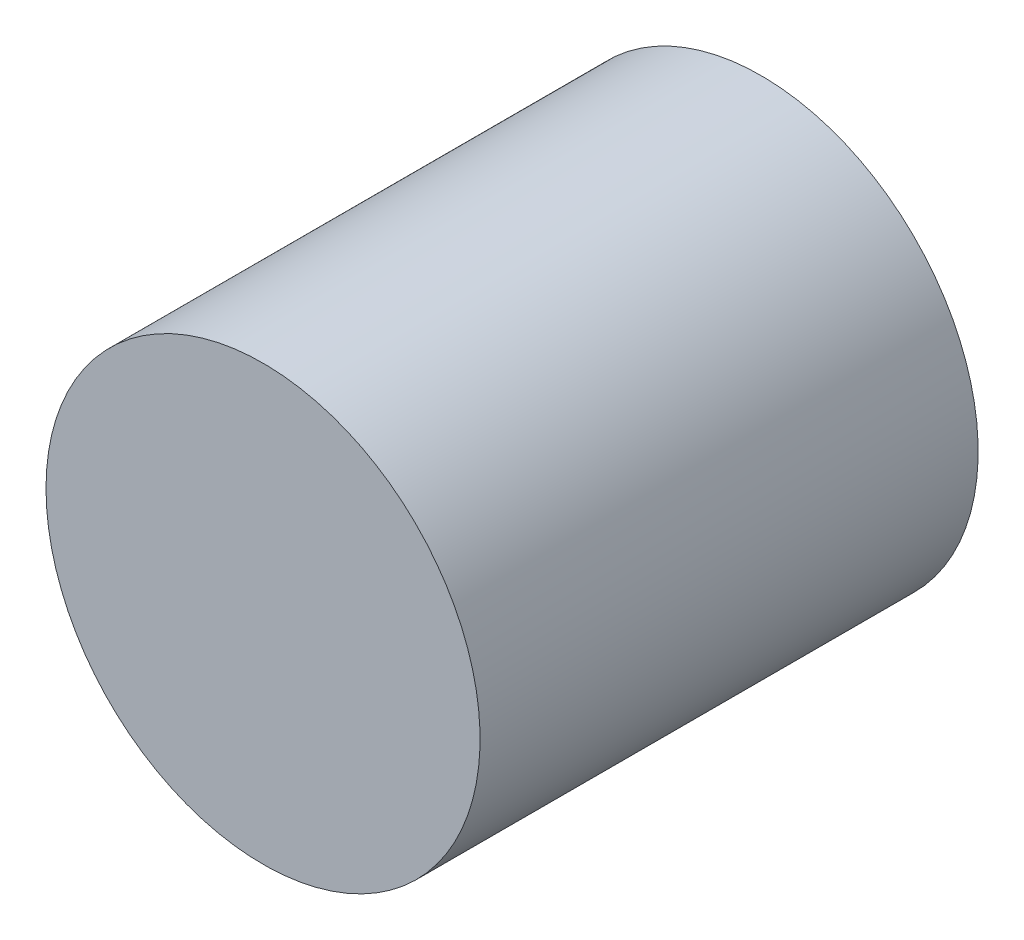
ISO-10303-21;
HEADER;
FILE_DESCRIPTION(('STEP AP214'),'2;1');
FILE_NAME('part.step','',(''),(''),'','','');
FILE_SCHEMA(('AUTOMOTIVE_DESIGN { 1 0 10303 214 1 1 1 1 }'));
ENDSEC;
DATA;
#1=APPLICATION_CONTEXT('core data for automotive mechanical design processes');
#2=APPLICATION_PROTOCOL_DEFINITION('international standard','automotive_design',2000,#1);
#3=PRODUCT_CONTEXT('',#1,'mechanical');
#4=PRODUCT('Part','Part','',(#3));
#5=PRODUCT_RELATED_PRODUCT_CATEGORY('part','',(#4));
#6=PRODUCT_DEFINITION_FORMATION('','',#4);
#7=PRODUCT_DEFINITION_CONTEXT('part definition',#1,'design');
#8=PRODUCT_DEFINITION('design','',#6,#7);
#9=PRODUCT_DEFINITION_SHAPE('','',#8);
#10=(LENGTH_UNIT() NAMED_UNIT(*) SI_UNIT(.MILLI.,.METRE.));
#11=(NAMED_UNIT(*) PLANE_ANGLE_UNIT() SI_UNIT($,.RADIAN.));
#12=(NAMED_UNIT(*) SI_UNIT($,.STERADIAN.) SOLID_ANGLE_UNIT());
#13=UNCERTAINTY_MEASURE_WITH_UNIT(LENGTH_MEASURE(1.E-05),#10,'distance_accuracy_value','');
#14=(GEOMETRIC_REPRESENTATION_CONTEXT(3) GLOBAL_UNCERTAINTY_ASSIGNED_CONTEXT((#13)) GLOBAL_UNIT_ASSIGNED_CONTEXT((#10,
#11,#12)) REPRESENTATION_CONTEXT('',''));
#15=CARTESIAN_POINT('',(0.,0.,0.));
#16=DIRECTION('',(0.,0.,1.));
#17=DIRECTION('',(1.,0.,0.));
#18=AXIS2_PLACEMENT_3D('',#15,#16,#17);
#19=CARTESIAN_POINT('',(-3.719,6.137,11.917));
#20=DIRECTION('',(0.,0.,-1.));
#21=DIRECTION('',(-1.,0.,0.));
#22=AXIS2_PLACEMENT_3D('',#19,#20,#21);
#23=CYLINDRICAL_SURFACE('',#22,5.193);
#24=CARTESIAN_POINT('',(-3.719,6.137,11.917));
#25=DIRECTION('',(0.,0.,1.));
#26=DIRECTION('',(1.,0.,0.));
#27=AXIS2_PLACEMENT_3D('',#24,#25,#26);
#28=CIRCLE('',#27,5.193);
#29=CARTESIAN_POINT('',(-8.912,6.137,11.917));
#30=VERTEX_POINT('',#29);
#31=EDGE_CURVE('E10',#30,#30,#28,.T.);
#32=CARTESIAN_POINT('',(-3.719,6.137,0.));
#33=DIRECTION('',(0.,0.,1.));
#34=DIRECTION('',(1.,0.,0.));
#35=AXIS2_PLACEMENT_3D('',#32,#33,#34);
#36=CIRCLE('',#35,5.193);
#37=CARTESIAN_POINT('',(-8.912,6.137,0.));
#38=VERTEX_POINT('',#37);
#39=EDGE_CURVE('E45',#38,#38,#36,.T.);
#40=CARTESIAN_POINT('',(-8.912,6.137,11.917));
#41=CARTESIAN_POINT('',(-8.912,6.137,11.7928645833333));
#42=CARTESIAN_POINT('',(-8.912,6.137,11.6687291666667));
#43=CARTESIAN_POINT('',(-8.912,6.137,11.4204583333333));
#44=CARTESIAN_POINT('',(-8.912,6.137,11.2963229166667));
#45=CARTESIAN_POINT('',(-8.912,6.137,11.0480520833333));
#46=CARTESIAN_POINT('',(-8.912,6.137,10.9239166666667));
#47=CARTESIAN_POINT('',(-8.912,6.137,10.6756458333333));
#48=CARTESIAN_POINT('',(-8.912,6.137,10.5515104166667));
#49=CARTESIAN_POINT('',(-8.912,6.137,10.3032395833333));
#50=CARTESIAN_POINT('',(-8.912,6.137,10.1791041666667));
#51=CARTESIAN_POINT('',(-8.912,6.137,9.93083333333333));
#52=CARTESIAN_POINT('',(-8.912,6.137,9.80669791666667));
#53=CARTESIAN_POINT('',(-8.912,6.137,9.55842708333333));
#54=CARTESIAN_POINT('',(-8.912,6.137,9.43429166666666));
#55=CARTESIAN_POINT('',(-8.912,6.137,9.18602083333333));
#56=CARTESIAN_POINT('',(-8.912,6.137,9.06188541666667));
#57=CARTESIAN_POINT('',(-8.912,6.137,8.81361458333333));
#58=CARTESIAN_POINT('',(-8.912,6.137,8.68947916666667));
#59=CARTESIAN_POINT('',(-8.912,6.137,8.44120833333333));
#60=CARTESIAN_POINT('',(-8.912,6.137,8.31707291666667));
#61=CARTESIAN_POINT('',(-8.912,6.137,8.06880208333333));
#62=CARTESIAN_POINT('',(-8.912,6.137,7.94466666666667));
#63=CARTESIAN_POINT('',(-8.912,6.137,7.69639583333333));
#64=CARTESIAN_POINT('',(-8.912,6.137,7.57226041666667));
#65=CARTESIAN_POINT('',(-8.912,6.137,7.32398958333333));
#66=CARTESIAN_POINT('',(-8.912,6.137,7.19985416666667));
#67=CARTESIAN_POINT('',(-8.912,6.137,6.95158333333333));
#68=CARTESIAN_POINT('',(-8.912,6.137,6.82744791666667));
#69=CARTESIAN_POINT('',(-8.912,6.137,6.57917708333333));
#70=CARTESIAN_POINT('',(-8.912,6.137,6.45504166666667));
#71=CARTESIAN_POINT('',(-8.912,6.137,6.20677083333333));
#72=CARTESIAN_POINT('',(-8.912,6.137,6.08263541666667));
#73=CARTESIAN_POINT('',(-8.912,6.137,5.83436458333333));
#74=CARTESIAN_POINT('',(-8.912,6.137,5.71022916666666));
#75=CARTESIAN_POINT('',(-8.912,6.137,5.46195833333333));
#76=CARTESIAN_POINT('',(-8.912,6.137,5.33782291666666));
#77=CARTESIAN_POINT('',(-8.912,6.137,5.08955208333333));
#78=CARTESIAN_POINT('',(-8.912,6.137,4.96541666666667));
#79=CARTESIAN_POINT('',(-8.912,6.137,4.71714583333333));
#80=CARTESIAN_POINT('',(-8.912,6.137,4.59301041666666));
#81=CARTESIAN_POINT('',(-8.912,6.137,4.34473958333333));
#82=CARTESIAN_POINT('',(-8.912,6.137,4.22060416666667));
#83=CARTESIAN_POINT('',(-8.912,6.137,3.97233333333333));
#84=CARTESIAN_POINT('',(-8.912,6.137,3.84819791666667));
#85=CARTESIAN_POINT('',(-8.912,6.137,3.59992708333333));
#86=CARTESIAN_POINT('',(-8.912,6.137,3.47579166666667));
#87=CARTESIAN_POINT('',(-8.912,6.137,3.22752083333333));
#88=CARTESIAN_POINT('',(-8.912,6.137,3.10338541666667));
#89=CARTESIAN_POINT('',(-8.912,6.137,2.85511458333333));
#90=CARTESIAN_POINT('',(-8.912,6.137,2.73097916666667));
#91=CARTESIAN_POINT('',(-8.912,6.137,2.48270833333333));
#92=CARTESIAN_POINT('',(-8.912,6.137,2.35857291666667));
#93=CARTESIAN_POINT('',(-8.912,6.137,2.11030208333333));
#94=CARTESIAN_POINT('',(-8.912,6.137,1.98616666666667));
#95=CARTESIAN_POINT('',(-8.912,6.137,1.73789583333333));
#96=CARTESIAN_POINT('',(-8.912,6.137,1.61376041666667));
#97=CARTESIAN_POINT('',(-8.912,6.137,1.36548958333333));
#98=CARTESIAN_POINT('',(-8.912,6.137,1.24135416666667));
#99=CARTESIAN_POINT('',(-8.912,6.137,0.993083333333333));
#100=CARTESIAN_POINT('',(-8.912,6.137,0.868947916666666));
#101=CARTESIAN_POINT('',(-8.912,6.137,0.620677083333332));
#102=CARTESIAN_POINT('',(-8.912,6.137,0.496541666666665));
#103=CARTESIAN_POINT('',(-8.912,6.137,0.248270833333332));
#104=CARTESIAN_POINT('',(-8.912,6.137,0.124135416666665));
#105=CARTESIAN_POINT('',(-8.912,6.137,0.));
#106=B_SPLINE_CURVE_WITH_KNOTS('',3,(#40,#41,#42,#43,#44,#45,#46,#47,#48,#49,#50,#51,#52,#53,
#54,#55,#56,#57,#58,#59,#60,#61,#62,#63,#64,#65,#66,#67,#68,#69,#70,#71,#72,#73,#74,#75,#76,#77,
#78,#79,#80,#81,#82,#83,#84,#85,#86,#87,#88,#89,#90,#91,#92,#93,#94,#95,#96,#97,#98,#99,#100,
#101,#102,#103,#104,#105),.UNSPECIFIED.,.F.,.F.,(4,2,2,2,2,2,2,2,2,2,2,2,2,2,2,2,2,2,2,2,2,2,2,
2,2,2,2,2,2,2,2,2,4),(0.,0.37240625,0.744812500000001,1.11721875,1.489625,1.86203125,2.2344375,
2.60684375,2.97925,3.35165625,3.7240625,4.09646875,4.468875,4.84128125,5.2136875,5.58609375,
5.9585,6.33090625,6.7033125,7.07571875,7.448125,7.82053125,8.1929375,8.56534375,8.93775,
9.31015625,9.6825625,10.05496875,10.427375,10.79978125,11.1721875,11.54459375,11.917),.UNSPECIFIED.);
#107=EDGE_CURVE('BSEAM39',#30,#38,#106,.T.);
#108=ORIENTED_EDGE('',*,*,#31,.F.);
#109=ORIENTED_EDGE('',*,*,#39,.T.);
#110=ORIENTED_EDGE('',*,*,#107,.T.);
#111=ORIENTED_EDGE('',*,*,#107,.F.);
#112=EDGE_LOOP('',(#108,#110,#109,#111));
#113=FACE_BOUND('',#112,.T.);
#114=ADVANCED_FACE('F39',(#113),#23,.T.);
#115=CARTESIAN_POINT('',(-3.719,6.137,11.917));
#116=DIRECTION('',(0.,0.,1.));
#117=DIRECTION('',(1.,0.,0.));
#118=AXIS2_PLACEMENT_3D('',#115,#116,#117);
#119=PLANE('',#118);
#120=ORIENTED_EDGE('',*,*,#31,.T.);
#121=EDGE_LOOP('',(#120));
#122=FACE_BOUND('',#121,.T.);
#123=ADVANCED_FACE('F53',(#122),#119,.T.);
#124=CARTESIAN_POINT('',(-3.719,6.137,0.));
#125=DIRECTION('',(0.,0.,1.));
#126=DIRECTION('',(1.,0.,0.));
#127=AXIS2_PLACEMENT_3D('',#124,#125,#126);
#128=PLANE('',#127);
#129=ORIENTED_EDGE('',*,*,#39,.F.);
#130=EDGE_LOOP('',(#129));
#131=FACE_BOUND('',#130,.T.);
#132=ADVANCED_FACE('F55',(#131),#128,.F.);
#133=CLOSED_SHELL('',(#114,#123,#132));
#134=MANIFOLD_SOLID_BREP('B2',#133);
#135=ADVANCED_BREP_SHAPE_REPRESENTATION('',(#18,#134),#14);
#136=SHAPE_DEFINITION_REPRESENTATION(#9,#135);
ENDSEC;
END-ISO-10303-21;
